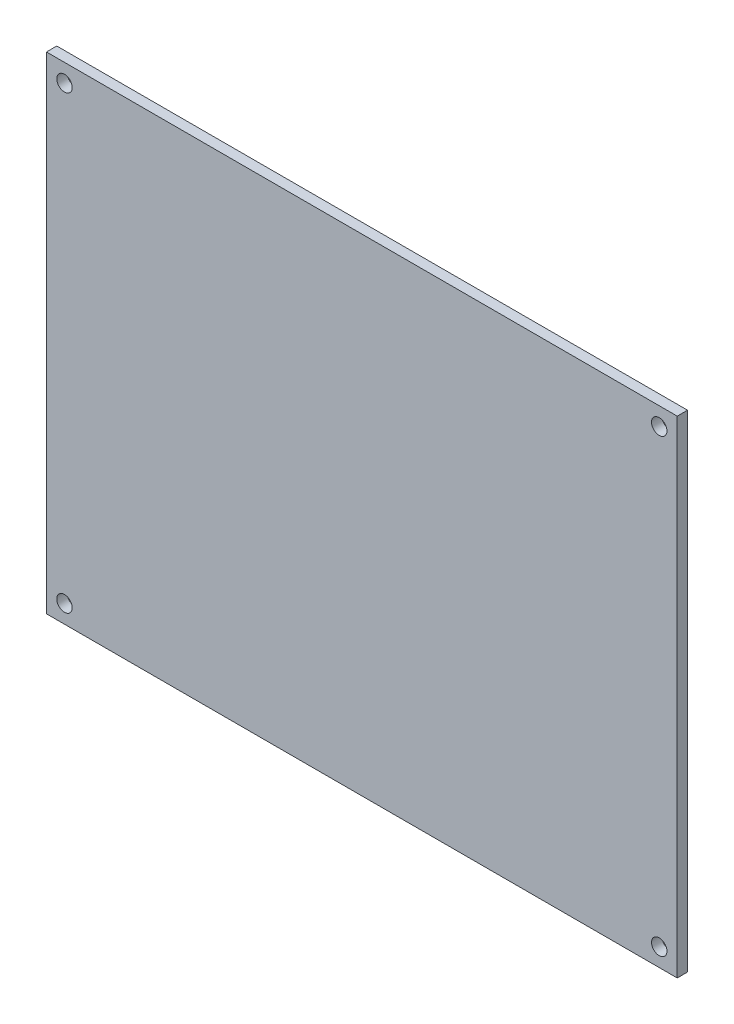
ISO-10303-21;
HEADER;
FILE_DESCRIPTION(('STEP AP214'),'2;1');
FILE_NAME('part.step','',(''),(''),'','','');
FILE_SCHEMA(('AUTOMOTIVE_DESIGN { 1 0 10303 214 1 1 1 1 }'));
ENDSEC;
DATA;
#1=APPLICATION_CONTEXT('core data for automotive mechanical design processes');
#2=APPLICATION_PROTOCOL_DEFINITION('international standard','automotive_design',2000,#1);
#3=PRODUCT_CONTEXT('',#1,'mechanical');
#4=PRODUCT('Part','Part','',(#3));
#5=PRODUCT_RELATED_PRODUCT_CATEGORY('part','',(#4));
#6=PRODUCT_DEFINITION_FORMATION('','',#4);
#7=PRODUCT_DEFINITION_CONTEXT('part definition',#1,'design');
#8=PRODUCT_DEFINITION('design','',#6,#7);
#9=PRODUCT_DEFINITION_SHAPE('','',#8);
#10=(LENGTH_UNIT() NAMED_UNIT(*) SI_UNIT(.MILLI.,.METRE.));
#11=(NAMED_UNIT(*) PLANE_ANGLE_UNIT() SI_UNIT($,.RADIAN.));
#12=(NAMED_UNIT(*) SI_UNIT($,.STERADIAN.) SOLID_ANGLE_UNIT());
#13=UNCERTAINTY_MEASURE_WITH_UNIT(LENGTH_MEASURE(1.E-05),#10,'distance_accuracy_value','');
#14=(GEOMETRIC_REPRESENTATION_CONTEXT(3) GLOBAL_UNCERTAINTY_ASSIGNED_CONTEXT((#13)) GLOBAL_UNIT_ASSIGNED_CONTEXT((#10,
#11,#12)) REPRESENTATION_CONTEXT('',''));
#15=CARTESIAN_POINT('',(0.,0.,0.));
#16=DIRECTION('',(0.,0.,1.));
#17=DIRECTION('',(1.,0.,0.));
#18=AXIS2_PLACEMENT_3D('',#15,#16,#17);
#19=CARTESIAN_POINT('',(0.,0.,2.));
#20=DIRECTION('',(0.,0.,1.));
#21=DIRECTION('',(1.,0.,0.));
#22=AXIS2_PLACEMENT_3D('',#19,#20,#21);
#23=PLANE('',#22);
#24=CARTESIAN_POINT('',(57.75,43.75,2.));
#25=DIRECTION('',(0.,0.,1.));
#26=DIRECTION('',(1.,0.,0.));
#27=AXIS2_PLACEMENT_3D('',#24,#25,#26);
#28=CIRCLE('',#27,1.5);
#29=CARTESIAN_POINT('',(59.25,43.75,2.));
#30=VERTEX_POINT('',#29);
#31=EDGE_CURVE('E142',#30,#30,#28,.T.);
#32=ORIENTED_EDGE('',*,*,#31,.F.);
#33=EDGE_LOOP('',(#32));
#34=FACE_BOUND('',#33,.T.);
#35=CARTESIAN_POINT('',(-57.75,43.75,2.));
#36=DIRECTION('',(0.,0.,1.));
#37=DIRECTION('',(1.,0.,0.));
#38=AXIS2_PLACEMENT_3D('',#35,#36,#37);
#39=CIRCLE('',#38,1.5);
#40=CARTESIAN_POINT('',(-56.25,43.75,2.));
#41=VERTEX_POINT('',#40);
#42=EDGE_CURVE('E112',#41,#41,#39,.T.);
#43=ORIENTED_EDGE('',*,*,#42,.F.);
#44=EDGE_LOOP('',(#43));
#45=FACE_BOUND('',#44,.T.);
#46=DIRECTION('',(0.,1.,0.));
#47=VECTOR('',#46,1.);
#48=CARTESIAN_POINT('',(61.25,47.25,2.));
#49=LINE('',#48,#47);
#50=CARTESIAN_POINT('',(61.25,-47.25,2.));
#51=VERTEX_POINT('',#50);
#52=CARTESIAN_POINT('',(61.25,47.25,2.));
#53=VERTEX_POINT('',#52);
#54=EDGE_CURVE('E92',#51,#53,#49,.T.);
#55=ORIENTED_EDGE('',*,*,#54,.T.);
#56=DIRECTION('',(-1.,0.,0.));
#57=VECTOR('',#56,1.);
#58=CARTESIAN_POINT('',(-61.25,47.25,2.));
#59=LINE('',#58,#57);
#60=CARTESIAN_POINT('',(-61.25,47.25,2.));
#61=VERTEX_POINT('',#60);
#62=EDGE_CURVE('E87',#53,#61,#59,.T.);
#63=ORIENTED_EDGE('',*,*,#62,.T.);
#64=DIRECTION('',(0.,-1.,0.));
#65=VECTOR('',#64,1.);
#66=CARTESIAN_POINT('',(-61.25,47.25,2.));
#67=LINE('',#66,#65);
#68=CARTESIAN_POINT('',(-61.25,-47.25,2.));
#69=VERTEX_POINT('',#68);
#70=EDGE_CURVE('E90',#61,#69,#67,.T.);
#71=ORIENTED_EDGE('',*,*,#70,.T.);
#72=DIRECTION('',(1.,0.,0.));
#73=VECTOR('',#72,1.);
#74=CARTESIAN_POINT('',(-61.25,-47.25,2.));
#75=LINE('',#74,#73);
#76=EDGE_CURVE('E57',#69,#51,#75,.T.);
#77=ORIENTED_EDGE('',*,*,#76,.T.);
#78=EDGE_LOOP('',(#55,#63,#71,#77));
#79=FACE_BOUND('',#78,.T.);
#80=CARTESIAN_POINT('',(-57.75,-43.75,2.));
#81=DIRECTION('',(0.,0.,1.));
#82=DIRECTION('',(1.,0.,0.));
#83=AXIS2_PLACEMENT_3D('',#80,#81,#82);
#84=CIRCLE('',#83,1.5);
#85=CARTESIAN_POINT('',(-56.25,-43.75,2.));
#86=VERTEX_POINT('',#85);
#87=EDGE_CURVE('E134',#86,#86,#84,.T.);
#88=ORIENTED_EDGE('',*,*,#87,.F.);
#89=EDGE_LOOP('',(#88));
#90=FACE_BOUND('',#89,.T.);
#91=CARTESIAN_POINT('',(57.75,-43.75,2.));
#92=DIRECTION('',(0.,0.,1.));
#93=DIRECTION('',(1.,0.,0.));
#94=AXIS2_PLACEMENT_3D('',#91,#92,#93);
#95=CIRCLE('',#94,1.5);
#96=CARTESIAN_POINT('',(59.25,-43.75,2.));
#97=VERTEX_POINT('',#96);
#98=EDGE_CURVE('E150',#97,#97,#95,.T.);
#99=ORIENTED_EDGE('',*,*,#98,.F.);
#100=EDGE_LOOP('',(#99));
#101=FACE_BOUND('',#100,.T.);
#102=ADVANCED_FACE('F39',(#34,#45,#79,#90,#101),#23,.T.);
#103=CARTESIAN_POINT('',(0.,0.,0.));
#104=DIRECTION('',(0.,0.,1.));
#105=DIRECTION('',(1.,0.,0.));
#106=AXIS2_PLACEMENT_3D('',#103,#104,#105);
#107=PLANE('',#106);
#108=DIRECTION('',(0.,1.,0.));
#109=VECTOR('',#108,1.);
#110=CARTESIAN_POINT('',(61.25,47.25,0.));
#111=LINE('',#110,#109);
#112=CARTESIAN_POINT('',(61.25,-47.25,0.));
#113=VERTEX_POINT('',#112);
#114=CARTESIAN_POINT('',(61.25,47.25,0.));
#115=VERTEX_POINT('',#114);
#116=EDGE_CURVE('E108',#113,#115,#111,.T.);
#117=ORIENTED_EDGE('',*,*,#116,.F.);
#118=DIRECTION('',(1.,0.,0.));
#119=VECTOR('',#118,1.);
#120=CARTESIAN_POINT('',(-61.25,-47.25,0.));
#121=LINE('',#120,#119);
#122=CARTESIAN_POINT('',(-61.25,-47.25,0.));
#123=VERTEX_POINT('',#122);
#124=EDGE_CURVE('E80',#123,#113,#121,.T.);
#125=ORIENTED_EDGE('',*,*,#124,.F.);
#126=DIRECTION('',(0.,-1.,0.));
#127=VECTOR('',#126,1.);
#128=CARTESIAN_POINT('',(-61.25,47.25,0.));
#129=LINE('',#128,#127);
#130=CARTESIAN_POINT('',(-61.25,47.25,0.));
#131=VERTEX_POINT('',#130);
#132=EDGE_CURVE('E74',#131,#123,#129,.T.);
#133=ORIENTED_EDGE('',*,*,#132,.F.);
#134=DIRECTION('',(-1.,0.,0.));
#135=VECTOR('',#134,1.);
#136=CARTESIAN_POINT('',(-61.25,47.25,0.));
#137=LINE('',#136,#135);
#138=EDGE_CURVE('E97',#115,#131,#137,.T.);
#139=ORIENTED_EDGE('',*,*,#138,.F.);
#140=EDGE_LOOP('',(#117,#125,#133,#139));
#141=FACE_BOUND('',#140,.T.);
#142=CARTESIAN_POINT('',(-57.75,43.75,0.));
#143=DIRECTION('',(0.,0.,1.));
#144=DIRECTION('',(1.,0.,0.));
#145=AXIS2_PLACEMENT_3D('',#142,#143,#144);
#146=CIRCLE('',#145,1.5);
#147=CARTESIAN_POINT('',(-56.25,43.75,0.));
#148=VERTEX_POINT('',#147);
#149=EDGE_CURVE('E130',#148,#148,#146,.T.);
#150=ORIENTED_EDGE('',*,*,#149,.T.);
#151=EDGE_LOOP('',(#150));
#152=FACE_BOUND('',#151,.T.);
#153=CARTESIAN_POINT('',(-57.75,-43.75,0.));
#154=DIRECTION('',(0.,0.,1.));
#155=DIRECTION('',(1.,0.,0.));
#156=AXIS2_PLACEMENT_3D('',#153,#154,#155);
#157=CIRCLE('',#156,1.5);
#158=CARTESIAN_POINT('',(-56.25,-43.75,0.));
#159=VERTEX_POINT('',#158);
#160=EDGE_CURVE('E138',#159,#159,#157,.T.);
#161=ORIENTED_EDGE('',*,*,#160,.T.);
#162=EDGE_LOOP('',(#161));
#163=FACE_BOUND('',#162,.T.);
#164=CARTESIAN_POINT('',(57.75,43.75,0.));
#165=DIRECTION('',(0.,0.,1.));
#166=DIRECTION('',(1.,0.,0.));
#167=AXIS2_PLACEMENT_3D('',#164,#165,#166);
#168=CIRCLE('',#167,1.5);
#169=CARTESIAN_POINT('',(59.25,43.75,0.));
#170=VERTEX_POINT('',#169);
#171=EDGE_CURVE('E146',#170,#170,#168,.T.);
#172=ORIENTED_EDGE('',*,*,#171,.T.);
#173=EDGE_LOOP('',(#172));
#174=FACE_BOUND('',#173,.T.);
#175=CARTESIAN_POINT('',(57.75,-43.75,0.));
#176=DIRECTION('',(0.,0.,1.));
#177=DIRECTION('',(1.,0.,0.));
#178=AXIS2_PLACEMENT_3D('',#175,#176,#177);
#179=CIRCLE('',#178,1.5);
#180=CARTESIAN_POINT('',(59.25,-43.75,0.));
#181=VERTEX_POINT('',#180);
#182=EDGE_CURVE('E154',#181,#181,#179,.T.);
#183=ORIENTED_EDGE('',*,*,#182,.T.);
#184=EDGE_LOOP('',(#183));
#185=FACE_BOUND('',#184,.T.);
#186=ADVANCED_FACE('F125',(#141,#152,#163,#174,#185),#107,.F.);
#187=CARTESIAN_POINT('',(61.25,47.25,2.));
#188=DIRECTION('',(-1.,0.,0.));
#189=DIRECTION('',(0.,-1.,0.));
#190=AXIS2_PLACEMENT_3D('',#187,#188,#189);
#191=PLANE('',#190);
#192=ORIENTED_EDGE('',*,*,#116,.T.);
#193=DIRECTION('',(0.,0.,-1.));
#194=VECTOR('',#193,1.);
#195=CARTESIAN_POINT('',(61.25,47.25,2.));
#196=LINE('',#195,#194);
#197=EDGE_CURVE('E11',#53,#115,#196,.T.);
#198=ORIENTED_EDGE('',*,*,#197,.F.);
#199=ORIENTED_EDGE('',*,*,#54,.F.);
#200=DIRECTION('',(0.,0.,-1.));
#201=VECTOR('',#200,1.);
#202=CARTESIAN_POINT('',(61.25,-47.25,2.));
#203=LINE('',#202,#201);
#204=EDGE_CURVE('E104',#51,#113,#203,.T.);
#205=ORIENTED_EDGE('',*,*,#204,.T.);
#206=EDGE_LOOP('',(#192,#198,#199,#205));
#207=FACE_BOUND('',#206,.T.);
#208=ADVANCED_FACE('F41',(#207),#191,.F.);
#209=CARTESIAN_POINT('',(-61.25,47.25,2.));
#210=DIRECTION('',(0.,-1.,0.));
#211=DIRECTION('',(0.,0.,-1.));
#212=AXIS2_PLACEMENT_3D('',#209,#210,#211);
#213=PLANE('',#212);
#214=ORIENTED_EDGE('',*,*,#138,.T.);
#215=DIRECTION('',(0.,0.,-1.));
#216=VECTOR('',#215,1.);
#217=CARTESIAN_POINT('',(-61.25,47.25,2.));
#218=LINE('',#217,#216);
#219=EDGE_CURVE('E49',#61,#131,#218,.T.);
#220=ORIENTED_EDGE('',*,*,#219,.F.);
#221=ORIENTED_EDGE('',*,*,#62,.F.);
#222=ORIENTED_EDGE('',*,*,#197,.T.);
#223=EDGE_LOOP('',(#214,#220,#221,#222));
#224=FACE_BOUND('',#223,.T.);
#225=ADVANCED_FACE('F96',(#224),#213,.F.);
#226=CARTESIAN_POINT('',(-61.25,47.25,2.));
#227=DIRECTION('',(1.,0.,0.));
#228=DIRECTION('',(0.,0.,-1.));
#229=AXIS2_PLACEMENT_3D('',#226,#227,#228);
#230=PLANE('',#229);
#231=ORIENTED_EDGE('',*,*,#132,.T.);
#232=DIRECTION('',(0.,0.,-1.));
#233=VECTOR('',#232,1.);
#234=CARTESIAN_POINT('',(-61.25,-47.25,2.));
#235=LINE('',#234,#233);
#236=EDGE_CURVE('E99',#69,#123,#235,.T.);
#237=ORIENTED_EDGE('',*,*,#236,.F.);
#238=ORIENTED_EDGE('',*,*,#70,.F.);
#239=ORIENTED_EDGE('',*,*,#219,.T.);
#240=EDGE_LOOP('',(#231,#237,#238,#239));
#241=FACE_BOUND('',#240,.T.);
#242=ADVANCED_FACE('F100',(#241),#230,.F.);
#243=CARTESIAN_POINT('',(-61.25,-47.25,2.));
#244=DIRECTION('',(0.,1.,0.));
#245=DIRECTION('',(0.,0.,1.));
#246=AXIS2_PLACEMENT_3D('',#243,#244,#245);
#247=PLANE('',#246);
#248=ORIENTED_EDGE('',*,*,#124,.T.);
#249=ORIENTED_EDGE('',*,*,#204,.F.);
#250=ORIENTED_EDGE('',*,*,#76,.F.);
#251=ORIENTED_EDGE('',*,*,#236,.T.);
#252=EDGE_LOOP('',(#248,#249,#250,#251));
#253=FACE_BOUND('',#252,.T.);
#254=ADVANCED_FACE('F122',(#253),#247,.F.);
#255=CARTESIAN_POINT('',(-57.75,43.75,2.));
#256=DIRECTION('',(0.,0.,-1.));
#257=DIRECTION('',(-1.,0.,0.));
#258=AXIS2_PLACEMENT_3D('',#255,#256,#257);
#259=CYLINDRICAL_SURFACE('',#258,1.5);
#260=ORIENTED_EDGE('',*,*,#42,.T.);
#261=EDGE_LOOP('',(#260));
#262=FACE_BOUND('',#261,.T.);
#263=ORIENTED_EDGE('',*,*,#149,.F.);
#264=EDGE_LOOP('',(#263));
#265=FACE_BOUND('',#264,.T.);
#266=ADVANCED_FACE('F175',(#262,#265),#259,.F.);
#267=CARTESIAN_POINT('',(-57.75,-43.75,2.));
#268=DIRECTION('',(0.,0.,-1.));
#269=DIRECTION('',(-1.,0.,0.));
#270=AXIS2_PLACEMENT_3D('',#267,#268,#269);
#271=CYLINDRICAL_SURFACE('',#270,1.5);
#272=ORIENTED_EDGE('',*,*,#87,.T.);
#273=EDGE_LOOP('',(#272));
#274=FACE_BOUND('',#273,.T.);
#275=ORIENTED_EDGE('',*,*,#160,.F.);
#276=EDGE_LOOP('',(#275));
#277=FACE_BOUND('',#276,.T.);
#278=ADVANCED_FACE('F221',(#274,#277),#271,.F.);
#279=CARTESIAN_POINT('',(57.75,43.75,2.));
#280=DIRECTION('',(0.,0.,-1.));
#281=DIRECTION('',(-1.,0.,0.));
#282=AXIS2_PLACEMENT_3D('',#279,#280,#281);
#283=CYLINDRICAL_SURFACE('',#282,1.5);
#284=ORIENTED_EDGE('',*,*,#31,.T.);
#285=EDGE_LOOP('',(#284));
#286=FACE_BOUND('',#285,.T.);
#287=ORIENTED_EDGE('',*,*,#171,.F.);
#288=EDGE_LOOP('',(#287));
#289=FACE_BOUND('',#288,.T.);
#290=ADVANCED_FACE('F229',(#286,#289),#283,.F.);
#291=CARTESIAN_POINT('',(57.75,-43.75,2.));
#292=DIRECTION('',(0.,0.,-1.));
#293=DIRECTION('',(-1.,0.,0.));
#294=AXIS2_PLACEMENT_3D('',#291,#292,#293);
#295=CYLINDRICAL_SURFACE('',#294,1.5);
#296=ORIENTED_EDGE('',*,*,#98,.T.);
#297=EDGE_LOOP('',(#296));
#298=FACE_BOUND('',#297,.T.);
#299=ORIENTED_EDGE('',*,*,#182,.F.);
#300=EDGE_LOOP('',(#299));
#301=FACE_BOUND('',#300,.T.);
#302=ADVANCED_FACE('F162',(#298,#301),#295,.F.);
#303=CLOSED_SHELL('',(#102,#186,#208,#225,#242,#254,#266,#278,#290,#302));
#304=MANIFOLD_SOLID_BREP('B2',#303);
#305=ADVANCED_BREP_SHAPE_REPRESENTATION('',(#18,#304),#14);
#306=SHAPE_DEFINITION_REPRESENTATION(#9,#305);
ENDSEC;
END-ISO-10303-21;
